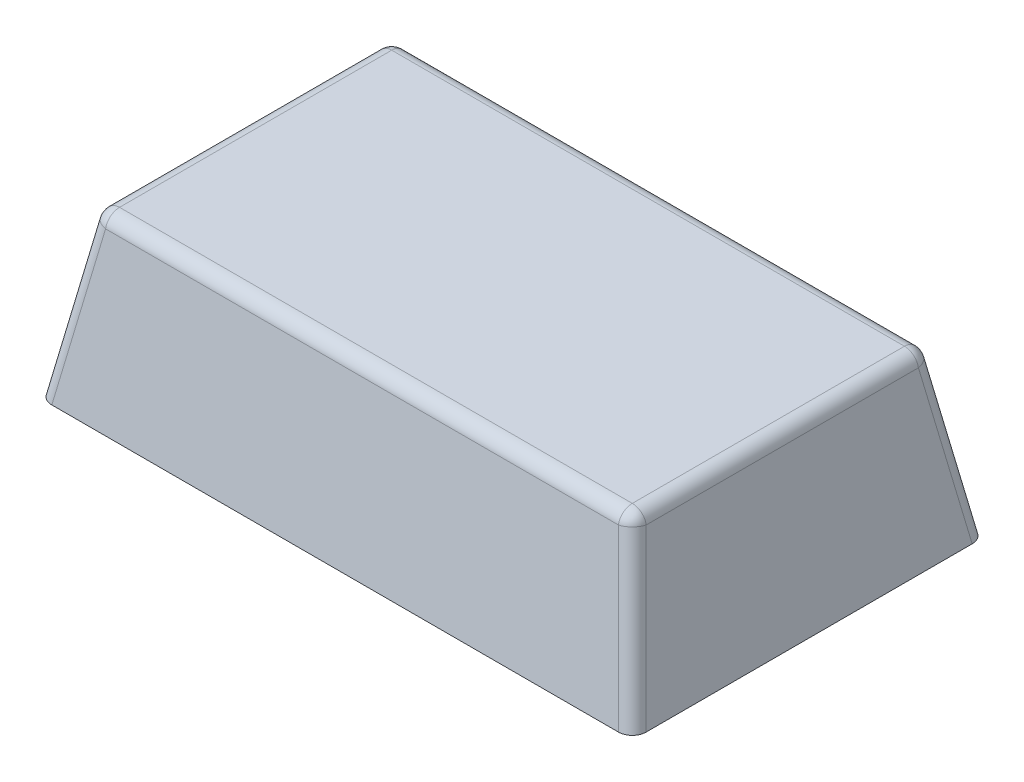
ISO-10303-21;
HEADER;
FILE_DESCRIPTION(('STEP AP214'),'2;1');
FILE_NAME('part.step','',(''),(''),'','','');
FILE_SCHEMA(('AUTOMOTIVE_DESIGN { 1 0 10303 214 1 1 1 1 }'));
ENDSEC;
DATA;
#1=APPLICATION_CONTEXT('core data for automotive mechanical design processes');
#2=APPLICATION_PROTOCOL_DEFINITION('international standard','automotive_design',2000,#1);
#3=PRODUCT_CONTEXT('',#1,'mechanical');
#4=PRODUCT('Part','Part','',(#3));
#5=PRODUCT_RELATED_PRODUCT_CATEGORY('part','',(#4));
#6=PRODUCT_DEFINITION_FORMATION('','',#4);
#7=PRODUCT_DEFINITION_CONTEXT('part definition',#1,'design');
#8=PRODUCT_DEFINITION('design','',#6,#7);
#9=PRODUCT_DEFINITION_SHAPE('','',#8);
#10=(LENGTH_UNIT() NAMED_UNIT(*) SI_UNIT(.MILLI.,.METRE.));
#11=(NAMED_UNIT(*) PLANE_ANGLE_UNIT() SI_UNIT($,.RADIAN.));
#12=(NAMED_UNIT(*) SI_UNIT($,.STERADIAN.) SOLID_ANGLE_UNIT());
#13=UNCERTAINTY_MEASURE_WITH_UNIT(LENGTH_MEASURE(1.E-05),#10,'distance_accuracy_value','');
#14=(GEOMETRIC_REPRESENTATION_CONTEXT(3) GLOBAL_UNCERTAINTY_ASSIGNED_CONTEXT((#13)) GLOBAL_UNIT_ASSIGNED_CONTEXT((#10,
#11,#12)) REPRESENTATION_CONTEXT('',''));
#15=CARTESIAN_POINT('',(0.,0.,0.));
#16=DIRECTION('',(0.,0.,1.));
#17=DIRECTION('',(1.,0.,0.));
#18=AXIS2_PLACEMENT_3D('',#15,#16,#17);
#19=CARTESIAN_POINT('',(-0.05,0.125,-0.804644660940671));
#20=DIRECTION('',(1.,0.,0.));
#21=DIRECTION('',(0.,0.,-1.));
#22=AXIS2_PLACEMENT_3D('',#19,#20,#21);
#23=CYLINDRICAL_SURFACE('',#22,0.025);
#24=CARTESIAN_POINT('',(-0.05,0.125,-0.804644660940671));
#25=DIRECTION('',(-1.,0.,0.));
#26=DIRECTION('',(0.,0.,-1.));
#27=AXIS2_PLACEMENT_3D('',#24,#25,#26);
#28=CIRCLE('',#27,0.025);
#29=CARTESIAN_POINT('',(-0.05,0.15,-0.804644660940671));
#30=VERTEX_POINT('',#29);
#31=CARTESIAN_POINT('',(-0.05,0.142677669529664,-0.822322330470334));
#32=VERTEX_POINT('',#31);
#33=EDGE_CURVE('E11',#30,#32,#28,.T.);
#34=ORIENTED_EDGE('',*,*,#33,.F.);
#35=DIRECTION('',(-1.,0.,0.));
#36=VECTOR('',#35,1.);
#37=CARTESIAN_POINT('',(-0.05,0.15,-0.804644660940671));
#38=LINE('',#37,#36);
#39=CARTESIAN_POINT('',(0.0264490471062698,0.15,-0.804644660940671));
#40=VERTEX_POINT('',#39);
#41=EDGE_CURVE('E150',#40,#30,#38,.T.);
#42=ORIENTED_EDGE('',*,*,#41,.F.);
#43=CARTESIAN_POINT('',(0.0220408725885936,0.125000000000191,-0.804644660940744));
#44=DIRECTION('',(0.984807753012219,-0.173648177666869,0.));
#45=DIRECTION('',(0.173648177666869,0.984807753012219,9.3683084217029E-11));
#46=AXIS2_PLACEMENT_3D('',#43,#44,#45);
#47=ELLIPSE('',#46,0.025385665296949,0.0249999999998879);
#48=CARTESIAN_POINT('',(0.0251579226826861,0.142677669529664,-0.822322330470334));
#49=VERTEX_POINT('',#48);
#50=EDGE_CURVE('E193',#49,#40,#47,.T.);
#51=ORIENTED_EDGE('',*,*,#50,.F.);
#52=DIRECTION('',(1.,0.,0.));
#53=VECTOR('',#52,1.);
#54=CARTESIAN_POINT('',(-0.05,0.142677669529664,-0.822322330470334));
#55=LINE('',#54,#53);
#56=EDGE_CURVE('E19',#32,#49,#55,.T.);
#57=ORIENTED_EDGE('',*,*,#56,.F.);
#58=EDGE_LOOP('',(#34,#42,#51,#57));
#59=FACE_BOUND('',#58,.T.);
#60=ADVANCED_FACE('F16',(#59),#23,.T.);
#61=CARTESIAN_POINT('',(-0.05,0.125,-0.445355339059329));
#62=DIRECTION('',(1.,0.,0.));
#63=DIRECTION('',(0.,0.,-1.));
#64=AXIS2_PLACEMENT_3D('',#61,#62,#63);
#65=CYLINDRICAL_SURFACE('',#64,0.025);
#66=CARTESIAN_POINT('',(-0.05,0.125,-0.445355339059329));
#67=DIRECTION('',(-1.,0.,0.));
#68=DIRECTION('',(0.,0.,-1.));
#69=AXIS2_PLACEMENT_3D('',#66,#67,#68);
#70=CIRCLE('',#69,0.025);
#71=CARTESIAN_POINT('',(-0.05,0.142677669529664,-0.427677669529666));
#72=VERTEX_POINT('',#71);
#73=CARTESIAN_POINT('',(-0.05,0.15,-0.445355339059329));
#74=VERTEX_POINT('',#73);
#75=EDGE_CURVE('E27',#72,#74,#70,.T.);
#76=ORIENTED_EDGE('',*,*,#75,.F.);
#77=DIRECTION('',(-1.,0.,0.));
#78=VECTOR('',#77,1.);
#79=CARTESIAN_POINT('',(-0.05,0.142677669529664,-0.427677669529666));
#80=LINE('',#79,#78);
#81=CARTESIAN_POINT('',(0.0251579226826861,0.142677669529664,-0.427677669529666));
#82=VERTEX_POINT('',#81);
#83=EDGE_CURVE('E173',#82,#72,#80,.T.);
#84=ORIENTED_EDGE('',*,*,#83,.F.);
#85=CARTESIAN_POINT('',(0.0220408725885665,0.125000000000038,-0.445355339059313));
#86=DIRECTION('',(0.984807753012219,-0.173648177666869,0.));
#87=DIRECTION('',(0.173648177666869,0.984807753012219,-2.07086392940052E-11));
#88=AXIS2_PLACEMENT_3D('',#85,#86,#87);
#89=ELLIPSE('',#88,0.025385665297105,0.0249999999999768);
#90=CARTESIAN_POINT('',(0.0264490471062698,0.15,-0.445355339059329));
#91=VERTEX_POINT('',#90);
#92=EDGE_CURVE('E197',#91,#82,#89,.T.);
#93=ORIENTED_EDGE('',*,*,#92,.F.);
#94=DIRECTION('',(1.,0.,0.));
#95=VECTOR('',#94,1.);
#96=CARTESIAN_POINT('',(-0.05,0.15,-0.445355339059329));
#97=LINE('',#96,#95);
#98=EDGE_CURVE('E159',#74,#91,#97,.T.);
#99=ORIENTED_EDGE('',*,*,#98,.F.);
#100=EDGE_LOOP('',(#76,#84,#93,#99));
#101=FACE_BOUND('',#100,.T.);
#102=ADVANCED_FACE('F578',(#101),#65,.T.);
#103=CARTESIAN_POINT('',(-0.05,0.,0.));
#104=DIRECTION('',(1.,0.,0.));
#105=DIRECTION('',(0.,1.,0.));
#106=AXIS2_PLACEMENT_3D('',#103,#104,#105);
#107=PLANE('',#106);
#108=DIRECTION('',(0.,-0.707106781186544,0.707106781186551));
#109=VECTOR('',#108,1.);
#110=CARTESIAN_POINT('',(-0.05,0.,-0.285));
#111=LINE('',#110,#109);
#112=CARTESIAN_POINT('',(-0.05,0.,-0.285));
#113=VERTEX_POINT('',#112);
#114=EDGE_CURVE('E167',#72,#113,#111,.T.);
#115=ORIENTED_EDGE('',*,*,#114,.F.);
#116=ORIENTED_EDGE('',*,*,#75,.T.);
#117=DIRECTION('',(0.,0.,1.));
#118=VECTOR('',#117,1.);
#119=CARTESIAN_POINT('',(-0.05,0.15,-0.435));
#120=LINE('',#119,#118);
#121=EDGE_CURVE('E152',#30,#74,#120,.T.);
#122=ORIENTED_EDGE('',*,*,#121,.F.);
#123=ORIENTED_EDGE('',*,*,#33,.T.);
#124=DIRECTION('',(0.,0.707106781186544,0.707106781186551));
#125=VECTOR('',#124,1.);
#126=CARTESIAN_POINT('',(-0.05,0.,-0.965));
#127=LINE('',#126,#125);
#128=CARTESIAN_POINT('',(-0.05,0.,-0.965));
#129=VERTEX_POINT('',#128);
#130=EDGE_CURVE('E157',#129,#32,#127,.T.);
#131=ORIENTED_EDGE('',*,*,#130,.F.);
#132=DIRECTION('',(0.,0.,-1.));
#133=VECTOR('',#132,1.);
#134=CARTESIAN_POINT('',(-0.05,0.,-0.965));
#135=LINE('',#134,#133);
#136=EDGE_CURVE('E281',#113,#129,#135,.T.);
#137=ORIENTED_EDGE('',*,*,#136,.F.);
#138=EDGE_LOOP('',(#115,#116,#122,#123,#131,#137));
#139=FACE_BOUND('',#138,.T.);
#140=ADVANCED_FACE('F162',(#139),#107,.F.);
#141=CARTESIAN_POINT('',(-0.05,0.,-0.965));
#142=DIRECTION('',(0.,0.707106781186551,-0.707106781186544));
#143=DIRECTION('',(-1.,0.,0.));
#144=AXIS2_PLACEMENT_3D('',#141,#142,#143);
#145=PLANE('',#144);
#146=ORIENTED_EDGE('',*,*,#130,.T.);
#147=ORIENTED_EDGE('',*,*,#56,.T.);
#148=DIRECTION('',(0.123724030206483,0.70167384315986,0.701673843159867));
#149=VECTOR('',#148,1.);
#150=CARTESIAN_POINT('',(0.0321766501374244,0.182482850940573,-0.782517149059425));
#151=LINE('',#150,#149);
#152=CARTESIAN_POINT('',(0.,0.,-0.965));
#153=VERTEX_POINT('',#152);
#154=EDGE_CURVE('E422',#153,#49,#151,.T.);
#155=ORIENTED_EDGE('',*,*,#154,.F.);
#156=DIRECTION('',(1.,0.,0.));
#157=VECTOR('',#156,1.);
#158=CARTESIAN_POINT('',(-0.05,0.,-0.965));
#159=LINE('',#158,#157);
#160=EDGE_CURVE('E285',#129,#153,#159,.T.);
#161=ORIENTED_EDGE('',*,*,#160,.F.);
#162=EDGE_LOOP('',(#146,#147,#155,#161));
#163=FACE_BOUND('',#162,.T.);
#164=ADVANCED_FACE('F595',(#163),#145,.T.);
#165=CARTESIAN_POINT('',(-0.05,0.15,-0.435));
#166=DIRECTION('',(0.,1.,0.));
#167=DIRECTION('',(0.,0.,-1.));
#168=AXIS2_PLACEMENT_3D('',#165,#166,#167);
#169=PLANE('',#168);
#170=ORIENTED_EDGE('',*,*,#121,.T.);
#171=ORIENTED_EDGE('',*,*,#98,.T.);
#172=DIRECTION('',(0.,0.,1.));
#173=VECTOR('',#172,1.);
#174=CARTESIAN_POINT('',(0.0264490471062698,0.15,-0.435));
#175=LINE('',#174,#173);
#176=EDGE_CURVE('E156',#40,#91,#175,.T.);
#177=ORIENTED_EDGE('',*,*,#176,.F.);
#178=ORIENTED_EDGE('',*,*,#41,.T.);
#179=EDGE_LOOP('',(#170,#171,#177,#178));
#180=FACE_BOUND('',#179,.T.);
#181=ADVANCED_FACE('F153',(#180),#169,.T.);
#182=CARTESIAN_POINT('',(-0.05,0.,-0.285));
#183=DIRECTION('',(0.,0.707106781186551,0.707106781186544));
#184=DIRECTION('',(1.,0.,0.));
#185=AXIS2_PLACEMENT_3D('',#182,#183,#184);
#186=PLANE('',#185);
#187=DIRECTION('',(-0.123724030206483,-0.70167384315986,0.701673843159867));
#188=VECTOR('',#187,1.);
#189=CARTESIAN_POINT('',(0.0321766501374244,0.182482850940573,-0.467482850940575));
#190=LINE('',#189,#188);
#191=CARTESIAN_POINT('',(0.,0.,-0.285));
#192=VERTEX_POINT('',#191);
#193=EDGE_CURVE('E210',#82,#192,#190,.T.);
#194=ORIENTED_EDGE('',*,*,#193,.F.);
#195=ORIENTED_EDGE('',*,*,#83,.T.);
#196=ORIENTED_EDGE('',*,*,#114,.T.);
#197=DIRECTION('',(1.,0.,0.));
#198=VECTOR('',#197,1.);
#199=CARTESIAN_POINT('',(-0.05,0.,-0.285));
#200=LINE('',#199,#198);
#201=EDGE_CURVE('E287',#113,#192,#200,.T.);
#202=ORIENTED_EDGE('',*,*,#201,.T.);
#203=EDGE_LOOP('',(#194,#195,#196,#202));
#204=FACE_BOUND('',#203,.T.);
#205=ADVANCED_FACE('F610',(#204),#186,.T.);
#206=CARTESIAN_POINT('',(2.05220093065007,-0.0168565311582944,-0.047799069349927));
#207=DIRECTION('',(0.171087869746036,-0.970287525247814,0.171087869746036));
#208=DIRECTION('',(0.,-0.173648177666931,-0.984807753012208));
#209=AXIS2_PLACEMENT_3D('',#206,#207,#208);
#210=CYLINDRICAL_SURFACE('',#209,0.05);
#211=CARTESIAN_POINT('',(1.95577536963023,0.53,-0.144224630369774));
#212=DIRECTION('',(0.171087869746036,-0.970287525247814,0.171087869746036));
#213=DIRECTION('',(-0.984807753012208,-0.173648177666931,0.));
#214=AXIS2_PLACEMENT_3D('',#211,#212,#213);
#215=CIRCLE('',#214,0.05);
#216=CARTESIAN_POINT('',(2.00501575728084,0.538682408883347,-0.144224630369774));
#217=VERTEX_POINT('',#216);
#218=CARTESIAN_POINT('',(1.95577536963023,0.538682408883347,-0.0949842427191635));
#219=VERTEX_POINT('',#218);
#220=EDGE_CURVE('E216',#217,#219,#215,.T.);
#221=ORIENTED_EDGE('',*,*,#220,.T.);
#222=DIRECTION('',(-0.171087869746036,0.970287525247814,-0.171087869746036));
#223=VECTOR('',#222,1.);
#224=CARTESIAN_POINT('',(1.99073170638418,0.340435171770235,-0.0600279059652134));
#225=LINE('',#224,#223);
#226=CARTESIAN_POINT('',(2.05075961234939,0.,0.));
#227=VERTEX_POINT('',#226);
#228=EDGE_CURVE('E211',#227,#219,#225,.T.);
#229=ORIENTED_EDGE('',*,*,#228,.F.);
#230=CARTESIAN_POINT('',(2.0492286694057,0.,-0.0507713305942965));
#231=DIRECTION('',(0.,-1.,0.));
#232=DIRECTION('',(-0.707106781186548,0.,-0.707106781186548));
#233=AXIS2_PLACEMENT_3D('',#230,#231,#232);
#234=ELLIPSE('',#233,0.0515311170132203,0.050000000000005);
#235=CARTESIAN_POINT('',(2.1,0.,-0.0492403876506104));
#236=VERTEX_POINT('',#235);
#237=EDGE_CURVE('E316',#236,#227,#234,.T.);
#238=ORIENTED_EDGE('',*,*,#237,.F.);
#239=DIRECTION('',(0.171087869746036,-0.970287525247814,0.171087869746036));
#240=VECTOR('',#239,1.);
#241=CARTESIAN_POINT('',(2.10144131830068,-0.00817412227494783,-0.047799069349927));
#242=LINE('',#241,#240);
#243=EDGE_CURVE('E247',#217,#236,#242,.T.);
#244=ORIENTED_EDGE('',*,*,#243,.F.);
#245=EDGE_LOOP('',(#221,#229,#238,#244));
#246=FACE_BOUND('',#245,.T.);
#247=ADVANCED_FACE('F377',(#246),#210,.T.);
#248=CARTESIAN_POINT('',(1.95577536963023,0.53,-0.144224630369774));
#249=DIRECTION('',(0.,1.,0.));
#250=DIRECTION('',(1.,0.,0.));
#251=AXIS2_PLACEMENT_3D('',#248,#249,#250);
#252=SPHERICAL_SURFACE('',#251,0.05);
#253=CARTESIAN_POINT('',(1.95577536963023,0.53,-0.144224630369774));
#254=DIRECTION('',(0.,0.,1.));
#255=DIRECTION('',(0.,-1.,0.));
#256=AXIS2_PLACEMENT_3D('',#253,#254,#255);
#257=CIRCLE('',#256,0.05);
#258=CARTESIAN_POINT('',(1.95577536963023,0.58,-0.144224630369774));
#259=VERTEX_POINT('',#258);
#260=EDGE_CURVE('E218',#217,#259,#257,.T.);
#261=ORIENTED_EDGE('',*,*,#260,.T.);
#262=CARTESIAN_POINT('',(1.95577536963023,0.53,-0.144224630369774));
#263=DIRECTION('',(1.,0.,0.));
#264=DIRECTION('',(0.,0.,-1.));
#265=AXIS2_PLACEMENT_3D('',#262,#263,#264);
#266=CIRCLE('',#265,0.05);
#267=EDGE_CURVE('E333',#259,#219,#266,.T.);
#268=ORIENTED_EDGE('',*,*,#267,.T.);
#269=ORIENTED_EDGE('',*,*,#220,.F.);
#270=EDGE_LOOP('',(#261,#268,#269));
#271=FACE_BOUND('',#270,.T.);
#272=ADVANCED_FACE('F343',(#271),#252,.T.);
#273=CARTESIAN_POINT('',(1.95577536963023,0.53,0.));
#274=DIRECTION('',(0.,0.,1.));
#275=DIRECTION('',(1.,0.,0.));
#276=AXIS2_PLACEMENT_3D('',#273,#274,#275);
#277=CYLINDRICAL_SURFACE('',#276,0.05);
#278=CARTESIAN_POINT('',(1.95577536963023,0.53,-1.10577536963023));
#279=DIRECTION('',(0.,0.,1.));
#280=DIRECTION('',(-1.,0.,0.));
#281=AXIS2_PLACEMENT_3D('',#278,#279,#280);
#282=CIRCLE('',#281,0.05);
#283=CARTESIAN_POINT('',(2.00501575728084,0.538682408883347,-1.10577536963023));
#284=VERTEX_POINT('',#283);
#285=CARTESIAN_POINT('',(1.95577536963023,0.58,-1.10577536963023));
#286=VERTEX_POINT('',#285);
#287=EDGE_CURVE('E339',#284,#286,#282,.T.);
#288=ORIENTED_EDGE('',*,*,#287,.T.);
#289=DIRECTION('',(0.,0.,-1.));
#290=VECTOR('',#289,1.);
#291=CARTESIAN_POINT('',(1.95577536963023,0.58,0.));
#292=LINE('',#291,#290);
#293=EDGE_CURVE('E302',#259,#286,#292,.T.);
#294=ORIENTED_EDGE('',*,*,#293,.F.);
#295=ORIENTED_EDGE('',*,*,#260,.F.);
#296=DIRECTION('',(0.,0.,1.));
#297=VECTOR('',#296,1.);
#298=CARTESIAN_POINT('',(2.00501575728084,0.538682408883347,0.));
#299=LINE('',#298,#297);
#300=EDGE_CURVE('E244',#284,#217,#299,.T.);
#301=ORIENTED_EDGE('',*,*,#300,.F.);
#302=EDGE_LOOP('',(#288,#294,#295,#301));
#303=FACE_BOUND('',#302,.T.);
#304=ADVANCED_FACE('F354',(#303),#277,.T.);
#305=CARTESIAN_POINT('',(0.,0.53,-0.144224630369774));
#306=DIRECTION('',(-1.,0.,0.));
#307=DIRECTION('',(0.,0.,1.));
#308=AXIS2_PLACEMENT_3D('',#305,#306,#307);
#309=CYLINDRICAL_SURFACE('',#308,0.05);
#310=CARTESIAN_POINT('',(0.144224630369774,0.53,-0.144224630369774));
#311=DIRECTION('',(1.,0.,0.));
#312=DIRECTION('',(0.,-1.,0.));
#313=AXIS2_PLACEMENT_3D('',#310,#311,#312);
#314=CIRCLE('',#313,0.05);
#315=CARTESIAN_POINT('',(0.144224630369774,0.58,-0.144224630369774));
#316=VERTEX_POINT('',#315);
#317=CARTESIAN_POINT('',(0.144224630369774,0.538682408883347,-0.0949842427191635));
#318=VERTEX_POINT('',#317);
#319=EDGE_CURVE('E331',#316,#318,#314,.T.);
#320=ORIENTED_EDGE('',*,*,#319,.T.);
#321=DIRECTION('',(-1.,0.,0.));
#322=VECTOR('',#321,1.);
#323=CARTESIAN_POINT('',(0.,0.538682408883347,-0.0949842427191635));
#324=LINE('',#323,#322);
#325=EDGE_CURVE('E236',#219,#318,#324,.T.);
#326=ORIENTED_EDGE('',*,*,#325,.F.);
#327=ORIENTED_EDGE('',*,*,#267,.F.);
#328=DIRECTION('',(1.,0.,0.));
#329=VECTOR('',#328,1.);
#330=CARTESIAN_POINT('',(0.,0.58,-0.144224630369774));
#331=LINE('',#330,#329);
#332=EDGE_CURVE('E299',#316,#259,#331,.T.);
#333=ORIENTED_EDGE('',*,*,#332,.F.);
#334=EDGE_LOOP('',(#320,#326,#327,#333));
#335=FACE_BOUND('',#334,.T.);
#336=ADVANCED_FACE('F353',(#335),#309,.T.);
#337=CARTESIAN_POINT('',(1.95577536963023,0.53,-1.10577536963023));
#338=DIRECTION('',(0.,1.,0.));
#339=DIRECTION('',(1.,0.,0.));
#340=AXIS2_PLACEMENT_3D('',#337,#338,#339);
#341=SPHERICAL_SURFACE('',#340,0.05);
#342=CARTESIAN_POINT('',(1.95577536963023,0.53,-1.10577536963023));
#343=DIRECTION('',(-0.171087869746036,0.970287525247814,0.171087869746036));
#344=DIRECTION('',(0.,-0.173648177666931,0.984807753012208));
#345=AXIS2_PLACEMENT_3D('',#342,#343,#344);
#346=CIRCLE('',#345,0.05);
#347=CARTESIAN_POINT('',(1.95577536963023,0.538682408883347,-1.15501575728084));
#348=VERTEX_POINT('',#347);
#349=EDGE_CURVE('E294',#284,#348,#346,.T.);
#350=ORIENTED_EDGE('',*,*,#349,.T.);
#351=CARTESIAN_POINT('',(1.95577536963023,0.53,-1.10577536963023));
#352=DIRECTION('',(1.,0.,0.));
#353=DIRECTION('',(0.,0.,-1.));
#354=AXIS2_PLACEMENT_3D('',#351,#352,#353);
#355=CIRCLE('',#354,0.05);
#356=EDGE_CURVE('E295',#348,#286,#355,.T.);
#357=ORIENTED_EDGE('',*,*,#356,.T.);
#358=ORIENTED_EDGE('',*,*,#287,.F.);
#359=EDGE_LOOP('',(#350,#357,#358));
#360=FACE_BOUND('',#359,.T.);
#361=ADVANCED_FACE('F391',(#360),#341,.T.);
#362=CARTESIAN_POINT('',(0.144224630369774,0.53,-0.144224630369774));
#363=DIRECTION('',(0.,1.,0.));
#364=DIRECTION('',(1.,0.,0.));
#365=AXIS2_PLACEMENT_3D('',#362,#363,#364);
#366=SPHERICAL_SURFACE('',#365,0.05);
#367=CARTESIAN_POINT('',(0.144224630369774,0.53,-0.144224630369774));
#368=DIRECTION('',(0.,0.,1.));
#369=DIRECTION('',(1.,0.,0.));
#370=AXIS2_PLACEMENT_3D('',#367,#368,#369);
#371=CIRCLE('',#370,0.05);
#372=CARTESIAN_POINT('',(0.0949842427191635,0.538682408883347,-0.144224630369774));
#373=VERTEX_POINT('',#372);
#374=EDGE_CURVE('E296',#316,#373,#371,.T.);
#375=ORIENTED_EDGE('',*,*,#374,.T.);
#376=CARTESIAN_POINT('',(0.144224630369774,0.53,-0.144224630369774));
#377=DIRECTION('',(0.171087869746036,0.970287525247814,-0.171087869746036));
#378=DIRECTION('',(0.,0.173648177666931,0.984807753012208));
#379=AXIS2_PLACEMENT_3D('',#376,#377,#378);
#380=CIRCLE('',#379,0.05);
#381=EDGE_CURVE('E268',#373,#318,#380,.T.);
#382=ORIENTED_EDGE('',*,*,#381,.T.);
#383=ORIENTED_EDGE('',*,*,#319,.F.);
#384=EDGE_LOOP('',(#375,#382,#383));
#385=FACE_BOUND('',#384,.T.);
#386=ADVANCED_FACE('F370',(#385),#366,.T.);
#387=CARTESIAN_POINT('',(1.99073170638418,0.331752762886889,-1.14073170638418));
#388=DIRECTION('',(0.171087869746036,-0.970287525247814,-0.171087869746036));
#389=DIRECTION('',(0.,0.173648177666931,-0.984807753012208));
#390=AXIS2_PLACEMENT_3D('',#387,#388,#389);
#391=CYLINDRICAL_SURFACE('',#390,0.05);
#392=CARTESIAN_POINT('',(2.04922866940573,0.,-1.19922866940573));
#393=DIRECTION('',(0.,-1.,0.));
#394=DIRECTION('',(0.707106781186548,0.,-0.707106781186548));
#395=AXIS2_PLACEMENT_3D('',#392,#393,#394);
#396=ELLIPSE('',#395,0.05153111701318,0.0499999999999894);
#397=CARTESIAN_POINT('',(2.05075961234939,0.,-1.25));
#398=VERTEX_POINT('',#397);
#399=CARTESIAN_POINT('',(2.1,0.,-1.20075961234939));
#400=VERTEX_POINT('',#399);
#401=EDGE_CURVE('E257',#398,#400,#396,.T.);
#402=ORIENTED_EDGE('',*,*,#401,.F.);
#403=DIRECTION('',(0.171087869746036,-0.970287525247814,-0.171087869746036));
#404=VECTOR('',#403,1.);
#405=CARTESIAN_POINT('',(1.99073170638418,0.340435171770235,-1.18997209403479));
#406=LINE('',#405,#404);
#407=EDGE_CURVE('E275',#348,#398,#406,.T.);
#408=ORIENTED_EDGE('',*,*,#407,.F.);
#409=ORIENTED_EDGE('',*,*,#349,.F.);
#410=DIRECTION('',(-0.171087869746036,0.970287525247814,0.171087869746036));
#411=VECTOR('',#410,1.);
#412=CARTESIAN_POINT('',(2.06485249433289,0.199331409894804,-1.16561210668228));
#413=LINE('',#412,#411);
#414=EDGE_CURVE('E255',#400,#284,#413,.T.);
#415=ORIENTED_EDGE('',*,*,#414,.F.);
#416=EDGE_LOOP('',(#402,#408,#409,#415));
#417=FACE_BOUND('',#416,.T.);
#418=ADVANCED_FACE('F397',(#417),#391,.T.);
#419=CARTESIAN_POINT('',(0.,0.53,-1.10577536963023));
#420=DIRECTION('',(1.,0.,0.));
#421=DIRECTION('',(0.,0.,-1.));
#422=AXIS2_PLACEMENT_3D('',#419,#420,#421);
#423=CYLINDRICAL_SURFACE('',#422,0.05);
#424=CARTESIAN_POINT('',(0.144224630369774,0.53,-1.10577536963023));
#425=DIRECTION('',(1.,0.,0.));
#426=DIRECTION('',(0.,0.,1.));
#427=AXIS2_PLACEMENT_3D('',#424,#425,#426);
#428=CIRCLE('',#427,0.05);
#429=CARTESIAN_POINT('',(0.144224630369774,0.538682408883347,-1.15501575728084));
#430=VERTEX_POINT('',#429);
#431=CARTESIAN_POINT('',(0.144224630369774,0.58,-1.10577536963023));
#432=VERTEX_POINT('',#431);
#433=EDGE_CURVE('E259',#430,#432,#428,.T.);
#434=ORIENTED_EDGE('',*,*,#433,.T.);
#435=DIRECTION('',(-1.,0.,0.));
#436=VECTOR('',#435,1.);
#437=CARTESIAN_POINT('',(0.,0.58,-1.10577536963023));
#438=LINE('',#437,#436);
#439=EDGE_CURVE('E306',#286,#432,#438,.T.);
#440=ORIENTED_EDGE('',*,*,#439,.F.);
#441=ORIENTED_EDGE('',*,*,#356,.F.);
#442=DIRECTION('',(1.,0.,0.));
#443=VECTOR('',#442,1.);
#444=CARTESIAN_POINT('',(0.,0.538682408883347,-1.15501575728084));
#445=LINE('',#444,#443);
#446=EDGE_CURVE('E262',#430,#348,#445,.T.);
#447=ORIENTED_EDGE('',*,*,#446,.F.);
#448=EDGE_LOOP('',(#434,#440,#441,#447));
#449=FACE_BOUND('',#448,.T.);
#450=ADVANCED_FACE('F403',(#449),#423,.T.);
#451=CARTESIAN_POINT('',(0.144224630369774,0.53,0.));
#452=DIRECTION('',(0.,0.,-1.));
#453=DIRECTION('',(-1.,0.,0.));
#454=AXIS2_PLACEMENT_3D('',#451,#452,#453);
#455=CYLINDRICAL_SURFACE('',#454,0.05);
#456=CARTESIAN_POINT('',(0.144224630369774,0.53,-1.10577536963023));
#457=DIRECTION('',(0.,0.,1.));
#458=DIRECTION('',(-1.,0.,0.));
#459=AXIS2_PLACEMENT_3D('',#456,#457,#458);
#460=CIRCLE('',#459,0.05);
#461=CARTESIAN_POINT('',(0.0949842427191635,0.538682408883347,-1.10577536963023));
#462=VERTEX_POINT('',#461);
#463=EDGE_CURVE('E264',#432,#462,#460,.T.);
#464=ORIENTED_EDGE('',*,*,#463,.T.);
#465=DIRECTION('',(0.,0.,-1.));
#466=VECTOR('',#465,1.);
#467=CARTESIAN_POINT('',(0.0949842427191635,0.538682408883347,0.));
#468=LINE('',#467,#466);
#469=EDGE_CURVE('E227',#373,#462,#468,.T.);
#470=ORIENTED_EDGE('',*,*,#469,.F.);
#471=ORIENTED_EDGE('',*,*,#374,.F.);
#472=DIRECTION('',(0.,0.,1.));
#473=VECTOR('',#472,1.);
#474=CARTESIAN_POINT('',(0.144224630369774,0.58,0.));
#475=LINE('',#474,#473);
#476=EDGE_CURVE('E288',#432,#316,#475,.T.);
#477=ORIENTED_EDGE('',*,*,#476,.F.);
#478=EDGE_LOOP('',(#464,#470,#471,#477));
#479=FACE_BOUND('',#478,.T.);
#480=ADVANCED_FACE('F361',(#479),#455,.T.);
#481=CARTESIAN_POINT('',(0.047799069349927,-0.0168565311582944,-0.047799069349927));
#482=DIRECTION('',(-0.171087869746036,-0.970287525247814,0.171087869746036));
#483=DIRECTION('',(0.,-0.173648177666931,-0.984807753012208));
#484=AXIS2_PLACEMENT_3D('',#481,#482,#483);
#485=CYLINDRICAL_SURFACE('',#484,0.05);
#486=CARTESIAN_POINT('',(0.0507713305942869,0.,-0.0507713305942869));
#487=DIRECTION('',(0.,-1.,0.));
#488=DIRECTION('',(0.707106781186548,0.,-0.707106781186548));
#489=AXIS2_PLACEMENT_3D('',#486,#487,#488);
#490=ELLIPSE('',#489,0.0515311170132064,0.05);
#491=CARTESIAN_POINT('',(0.0492403876506104,0.,0.));
#492=VERTEX_POINT('',#491);
#493=CARTESIAN_POINT('',(0.,0.,-0.0492403876506104));
#494=VERTEX_POINT('',#493);
#495=EDGE_CURVE('E317',#492,#494,#490,.T.);
#496=ORIENTED_EDGE('',*,*,#495,.F.);
#497=DIRECTION('',(-0.171087869746036,-0.970287525247814,0.171087869746036));
#498=VECTOR('',#497,1.);
#499=CARTESIAN_POINT('',(0.047799069349927,-0.00817412227494783,0.00144131830068336));
#500=LINE('',#499,#498);
#501=EDGE_CURVE('E241',#318,#492,#500,.T.);
#502=ORIENTED_EDGE('',*,*,#501,.F.);
#503=ORIENTED_EDGE('',*,*,#381,.F.);
#504=DIRECTION('',(0.171087869746036,0.970287525247814,-0.171087869746036));
#505=VECTOR('',#504,1.);
#506=CARTESIAN_POINT('',(-0.00144131830068336,-0.00817412227494783,-0.047799069349927));
#507=LINE('',#506,#505);
#508=EDGE_CURVE('E224',#494,#373,#507,.T.);
#509=ORIENTED_EDGE('',*,*,#508,.F.);
#510=EDGE_LOOP('',(#496,#502,#503,#509));
#511=FACE_BOUND('',#510,.T.);
#512=ADVANCED_FACE('F371',(#511),#485,.T.);
#513=CARTESIAN_POINT('',(0.144224630369774,0.53,-1.10577536963023));
#514=DIRECTION('',(0.,1.,0.));
#515=DIRECTION('',(1.,0.,0.));
#516=AXIS2_PLACEMENT_3D('',#513,#514,#515);
#517=SPHERICAL_SURFACE('',#516,0.05);
#518=ORIENTED_EDGE('',*,*,#433,.F.);
#519=CARTESIAN_POINT('',(0.144224630369774,0.53,-1.10577536963023));
#520=DIRECTION('',(0.171087869746036,0.970287525247814,0.171087869746036));
#521=DIRECTION('',(-0.984807753012208,0.173648177666931,0.));
#522=AXIS2_PLACEMENT_3D('',#519,#520,#521);
#523=CIRCLE('',#522,0.05);
#524=EDGE_CURVE('E254',#430,#462,#523,.T.);
#525=ORIENTED_EDGE('',*,*,#524,.T.);
#526=ORIENTED_EDGE('',*,*,#463,.F.);
#527=EDGE_LOOP('',(#518,#525,#526));
#528=FACE_BOUND('',#527,.T.);
#529=ADVANCED_FACE('F406',(#528),#517,.T.);
#530=CARTESIAN_POINT('',(0.0843878933177227,0.190649001011457,-1.16561210668228));
#531=DIRECTION('',(-0.171087869746036,-0.970287525247814,-0.171087869746036));
#532=DIRECTION('',(0.,0.173648177666931,-0.984807753012208));
#533=AXIS2_PLACEMENT_3D('',#530,#531,#532);
#534=CYLINDRICAL_SURFACE('',#533,0.05);
#535=ORIENTED_EDGE('',*,*,#524,.F.);
#536=DIRECTION('',(0.171087869746036,0.970287525247814,0.171087869746036));
#537=VECTOR('',#536,1.);
#538=CARTESIAN_POINT('',(0.0477990693499271,-0.00817412227494783,-1.25144131830068));
#539=LINE('',#538,#537);
#540=CARTESIAN_POINT('',(0.0492403876506104,0.,-1.25));
#541=VERTEX_POINT('',#540);
#542=EDGE_CURVE('E276',#541,#430,#539,.T.);
#543=ORIENTED_EDGE('',*,*,#542,.F.);
#544=CARTESIAN_POINT('',(0.0507713305943012,0.,-1.1992286694057));
#545=DIRECTION('',(0.,-1.,0.));
#546=DIRECTION('',(-0.707106781186548,0.,-0.707106781186548));
#547=AXIS2_PLACEMENT_3D('',#544,#545,#546);
#548=ELLIPSE('',#547,0.0515311170132268,0.0500000000000078);
#549=CARTESIAN_POINT('',(0.,0.,-1.20075961234939));
#550=VERTEX_POINT('',#549);
#551=EDGE_CURVE('E315',#550,#541,#548,.T.);
#552=ORIENTED_EDGE('',*,*,#551,.F.);
#553=DIRECTION('',(-0.171087869746036,-0.970287525247814,-0.171087869746036));
#554=VECTOR('',#553,1.);
#555=CARTESIAN_POINT('',(0.0351475056671123,0.199331409894804,-1.16561210668228));
#556=LINE('',#555,#554);
#557=EDGE_CURVE('E201',#462,#550,#556,.T.);
#558=ORIENTED_EDGE('',*,*,#557,.F.);
#559=EDGE_LOOP('',(#535,#543,#552,#558));
#560=FACE_BOUND('',#559,.T.);
#561=ADVANCED_FACE('F408',(#560),#534,.T.);
#562=CARTESIAN_POINT('',(0.,0.,0.));
#563=DIRECTION('',(0.,-1.,0.));
#564=DIRECTION('',(0.,0.,-1.));
#565=AXIS2_PLACEMENT_3D('',#562,#563,#564);
#566=PLANE('',#565);
#567=DIRECTION('',(0.,0.,-1.));
#568=VECTOR('',#567,1.);
#569=CARTESIAN_POINT('',(2.1,0.,0.));
#570=LINE('',#569,#568);
#571=EDGE_CURVE('E249',#236,#400,#570,.T.);
#572=ORIENTED_EDGE('',*,*,#571,.F.);
#573=ORIENTED_EDGE('',*,*,#237,.T.);
#574=DIRECTION('',(1.,0.,0.));
#575=VECTOR('',#574,1.);
#576=CARTESIAN_POINT('',(0.,0.,0.));
#577=LINE('',#576,#575);
#578=EDGE_CURVE('E205',#492,#227,#577,.T.);
#579=ORIENTED_EDGE('',*,*,#578,.F.);
#580=ORIENTED_EDGE('',*,*,#495,.T.);
#581=DIRECTION('',(0.,0.,1.));
#582=VECTOR('',#581,1.);
#583=CARTESIAN_POINT('',(0.,0.,0.));
#584=LINE('',#583,#582);
#585=EDGE_CURVE('E212',#192,#494,#584,.T.);
#586=ORIENTED_EDGE('',*,*,#585,.F.);
#587=ORIENTED_EDGE('',*,*,#201,.F.);
#588=ORIENTED_EDGE('',*,*,#136,.T.);
#589=ORIENTED_EDGE('',*,*,#160,.T.);
#590=DIRECTION('',(0.,0.,1.));
#591=VECTOR('',#590,1.);
#592=CARTESIAN_POINT('',(0.,0.,0.));
#593=LINE('',#592,#591);
#594=EDGE_CURVE('E196',#550,#153,#593,.T.);
#595=ORIENTED_EDGE('',*,*,#594,.F.);
#596=ORIENTED_EDGE('',*,*,#551,.T.);
#597=DIRECTION('',(-1.,0.,0.));
#598=VECTOR('',#597,1.);
#599=CARTESIAN_POINT('',(0.,0.,-1.25));
#600=LINE('',#599,#598);
#601=EDGE_CURVE('E277',#398,#541,#600,.T.);
#602=ORIENTED_EDGE('',*,*,#601,.F.);
#603=ORIENTED_EDGE('',*,*,#401,.T.);
#604=EDGE_LOOP('',(#572,#573,#579,#580,#586,#587,#588,#589,#595,#596,#602,#603));
#605=FACE_BOUND('',#604,.T.);
#606=ADVANCED_FACE('F420',(#605),#566,.T.);
#607=CARTESIAN_POINT('',(0.,0.58,0.));
#608=DIRECTION('',(0.,-1.,0.));
#609=DIRECTION('',(0.,0.,-1.));
#610=AXIS2_PLACEMENT_3D('',#607,#608,#609);
#611=PLANE('',#610);
#612=ORIENTED_EDGE('',*,*,#476,.T.);
#613=ORIENTED_EDGE('',*,*,#332,.T.);
#614=ORIENTED_EDGE('',*,*,#293,.T.);
#615=ORIENTED_EDGE('',*,*,#439,.T.);
#616=EDGE_LOOP('',(#612,#613,#614,#615));
#617=FACE_BOUND('',#616,.T.);
#618=ADVANCED_FACE('F358',(#617),#611,.F.);
#619=CARTESIAN_POINT('',(0.,0.,-1.25));
#620=DIRECTION('',(0.,0.173648177666931,-0.984807753012208));
#621=DIRECTION('',(-1.,0.,0.));
#622=AXIS2_PLACEMENT_3D('',#619,#620,#621);
#623=PLANE('',#622);
#624=ORIENTED_EDGE('',*,*,#446,.T.);
#625=ORIENTED_EDGE('',*,*,#407,.T.);
#626=ORIENTED_EDGE('',*,*,#601,.T.);
#627=ORIENTED_EDGE('',*,*,#542,.T.);
#628=EDGE_LOOP('',(#624,#625,#626,#627));
#629=FACE_BOUND('',#628,.T.);
#630=ADVANCED_FACE('F398',(#629),#623,.T.);
#631=CARTESIAN_POINT('',(2.1,0.,0.));
#632=DIRECTION('',(0.984807753012208,0.173648177666931,0.));
#633=DIRECTION('',(0.,0.,-1.));
#634=AXIS2_PLACEMENT_3D('',#631,#632,#633);
#635=PLANE('',#634);
#636=ORIENTED_EDGE('',*,*,#300,.T.);
#637=ORIENTED_EDGE('',*,*,#243,.T.);
#638=ORIENTED_EDGE('',*,*,#571,.T.);
#639=ORIENTED_EDGE('',*,*,#414,.T.);
#640=EDGE_LOOP('',(#636,#637,#638,#639));
#641=FACE_BOUND('',#640,.T.);
#642=ADVANCED_FACE('F384',(#641),#635,.T.);
#643=CARTESIAN_POINT('',(0.,0.,0.));
#644=DIRECTION('',(0.,0.173648177666931,0.984807753012208));
#645=DIRECTION('',(1.,0.,0.));
#646=AXIS2_PLACEMENT_3D('',#643,#644,#645);
#647=PLANE('',#646);
#648=ORIENTED_EDGE('',*,*,#578,.T.);
#649=ORIENTED_EDGE('',*,*,#228,.T.);
#650=ORIENTED_EDGE('',*,*,#325,.T.);
#651=ORIENTED_EDGE('',*,*,#501,.T.);
#652=EDGE_LOOP('',(#648,#649,#650,#651));
#653=FACE_BOUND('',#652,.T.);
#654=ADVANCED_FACE('F376',(#653),#647,.T.);
#655=CARTESIAN_POINT('',(0.,0.,0.));
#656=DIRECTION('',(-0.984807753012208,0.173648177666931,0.));
#657=DIRECTION('',(0.,0.,1.));
#658=AXIS2_PLACEMENT_3D('',#655,#656,#657);
#659=PLANE('',#658);
#660=ORIENTED_EDGE('',*,*,#154,.T.);
#661=ORIENTED_EDGE('',*,*,#50,.T.);
#662=ORIENTED_EDGE('',*,*,#176,.T.);
#663=ORIENTED_EDGE('',*,*,#92,.T.);
#664=ORIENTED_EDGE('',*,*,#193,.T.);
#665=ORIENTED_EDGE('',*,*,#585,.T.);
#666=ORIENTED_EDGE('',*,*,#508,.T.);
#667=ORIENTED_EDGE('',*,*,#469,.T.);
#668=ORIENTED_EDGE('',*,*,#557,.T.);
#669=ORIENTED_EDGE('',*,*,#594,.T.);
#670=EDGE_LOOP('',(#660,#661,#662,#663,#664,#665,#666,#667,#668,#669));
#671=FACE_BOUND('',#670,.T.);
#672=ADVANCED_FACE('F412',(#671),#659,.T.);
#673=CLOSED_SHELL('',(#60,#102,#140,#164,#181,#205,#247,#272,#304,#336,#361,#386,#418,#450,#480,
#512,#529,#561,#606,#618,#630,#642,#654,#672));
#674=MANIFOLD_SOLID_BREP('B1',#673);
#675=ADVANCED_BREP_SHAPE_REPRESENTATION('',(#18,#674),#14);
#676=SHAPE_DEFINITION_REPRESENTATION(#9,#675);
ENDSEC;
END-ISO-10303-21;
